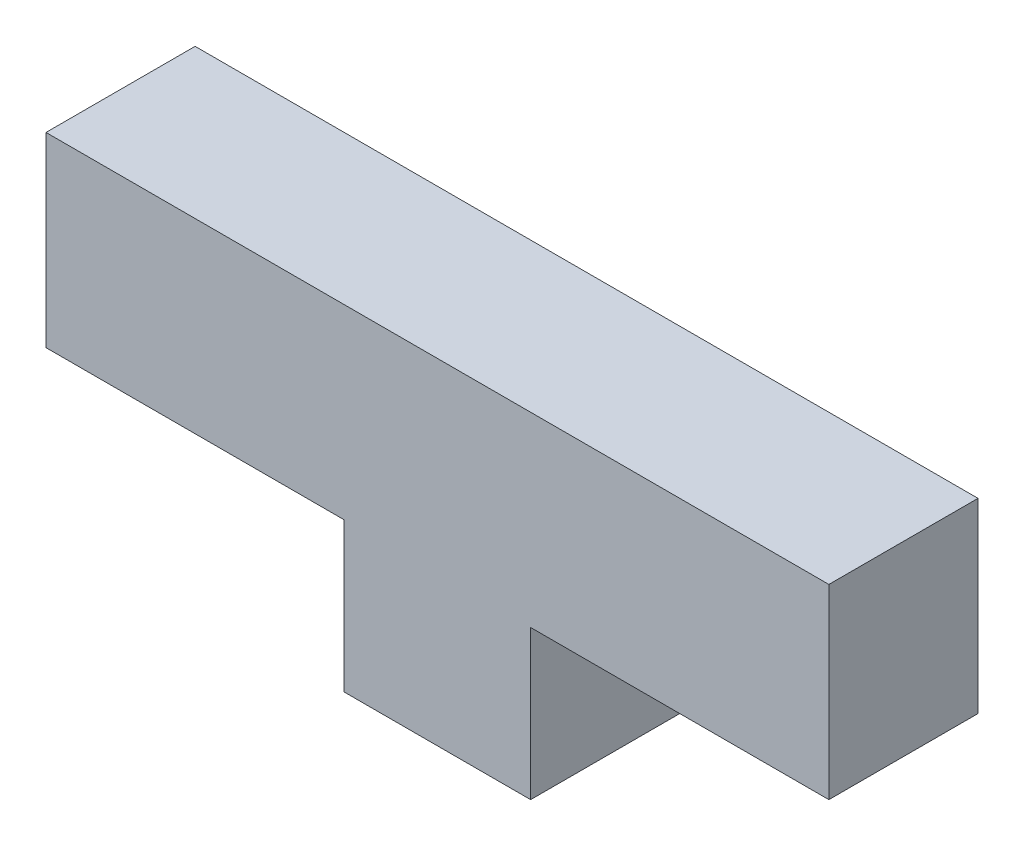
ISO-10303-21;
HEADER;
FILE_DESCRIPTION(('STEP AP214'),'2;1');
FILE_NAME('part.step','',(''),(''),'','','');
FILE_SCHEMA(('AUTOMOTIVE_DESIGN { 1 0 10303 214 1 1 1 1 }'));
ENDSEC;
DATA;
#1=APPLICATION_CONTEXT('core data for automotive mechanical design processes');
#2=APPLICATION_PROTOCOL_DEFINITION('international standard','automotive_design',2000,#1);
#3=PRODUCT_CONTEXT('',#1,'mechanical');
#4=PRODUCT('Part','Part','',(#3));
#5=PRODUCT_RELATED_PRODUCT_CATEGORY('part','',(#4));
#6=PRODUCT_DEFINITION_FORMATION('','',#4);
#7=PRODUCT_DEFINITION_CONTEXT('part definition',#1,'design');
#8=PRODUCT_DEFINITION('design','',#6,#7);
#9=PRODUCT_DEFINITION_SHAPE('','',#8);
#10=(LENGTH_UNIT() NAMED_UNIT(*) SI_UNIT(.MILLI.,.METRE.));
#11=(NAMED_UNIT(*) PLANE_ANGLE_UNIT() SI_UNIT($,.RADIAN.));
#12=(NAMED_UNIT(*) SI_UNIT($,.STERADIAN.) SOLID_ANGLE_UNIT());
#13=UNCERTAINTY_MEASURE_WITH_UNIT(LENGTH_MEASURE(1.E-05),#10,'distance_accuracy_value','');
#14=(GEOMETRIC_REPRESENTATION_CONTEXT(3) GLOBAL_UNCERTAINTY_ASSIGNED_CONTEXT((#13)) GLOBAL_UNIT_ASSIGNED_CONTEXT((#10,
#11,#12)) REPRESENTATION_CONTEXT('',''));
#15=CARTESIAN_POINT('',(0.,0.,0.));
#16=DIRECTION('',(0.,0.,1.));
#17=DIRECTION('',(1.,0.,0.));
#18=AXIS2_PLACEMENT_3D('',#15,#16,#17);
#19=CARTESIAN_POINT('',(3.175,-3.175,5.08));
#20=DIRECTION('',(0.,1.,0.));
#21=DIRECTION('',(-1.,0.,0.));
#22=AXIS2_PLACEMENT_3D('',#19,#20,#21);
#23=PLANE('',#22);
#24=DIRECTION('',(1.,0.,0.));
#25=VECTOR('',#24,1.);
#26=CARTESIAN_POINT('',(3.175,-3.175,0.));
#27=LINE('',#26,#25);
#28=CARTESIAN_POINT('',(3.175,-3.175,0.));
#29=VERTEX_POINT('',#28);
#30=CARTESIAN_POINT('',(13.3350000000001,-3.175,0.));
#31=VERTEX_POINT('',#30);
#32=EDGE_CURVE('E129',#29,#31,#27,.T.);
#33=ORIENTED_EDGE('',*,*,#32,.T.);
#34=DIRECTION('',(0.,0.,-1.));
#35=VECTOR('',#34,1.);
#36=CARTESIAN_POINT('',(13.3350000000001,-3.175,5.08));
#37=LINE('',#36,#35);
#38=CARTESIAN_POINT('',(13.3350000000001,-3.175,5.08));
#39=VERTEX_POINT('',#38);
#40=EDGE_CURVE('E11',#39,#31,#37,.T.);
#41=ORIENTED_EDGE('',*,*,#40,.F.);
#42=DIRECTION('',(1.,0.,0.));
#43=VECTOR('',#42,1.);
#44=CARTESIAN_POINT('',(3.175,-3.175,5.08));
#45=LINE('',#44,#43);
#46=CARTESIAN_POINT('',(3.175,-3.175,5.08));
#47=VERTEX_POINT('',#46);
#48=EDGE_CURVE('E143',#47,#39,#45,.T.);
#49=ORIENTED_EDGE('',*,*,#48,.F.);
#50=DIRECTION('',(0.,0.,-1.));
#51=VECTOR('',#50,1.);
#52=CARTESIAN_POINT('',(3.175,-3.175,5.08));
#53=LINE('',#52,#51);
#54=EDGE_CURVE('E125',#47,#29,#53,.T.);
#55=ORIENTED_EDGE('',*,*,#54,.T.);
#56=EDGE_LOOP('',(#33,#41,#49,#55));
#57=FACE_BOUND('',#56,.T.);
#58=ADVANCED_FACE('F33',(#57),#23,.F.);
#59=CARTESIAN_POINT('',(13.3350000000001,3.175,5.08));
#60=DIRECTION('',(-1.,0.,0.));
#61=DIRECTION('',(0.,0.,1.));
#62=AXIS2_PLACEMENT_3D('',#59,#60,#61);
#63=PLANE('',#62);
#64=DIRECTION('',(0.,1.,0.));
#65=VECTOR('',#64,1.);
#66=CARTESIAN_POINT('',(13.3350000000001,3.175,0.));
#67=LINE('',#66,#65);
#68=CARTESIAN_POINT('',(13.3350000000001,3.175,0.));
#69=VERTEX_POINT('',#68);
#70=EDGE_CURVE('E132',#31,#69,#67,.T.);
#71=ORIENTED_EDGE('',*,*,#70,.T.);
#72=DIRECTION('',(0.,0.,-1.));
#73=VECTOR('',#72,1.);
#74=CARTESIAN_POINT('',(13.3350000000001,3.175,5.08));
#75=LINE('',#74,#73);
#76=CARTESIAN_POINT('',(13.3350000000001,3.175,5.08));
#77=VERTEX_POINT('',#76);
#78=EDGE_CURVE('E41',#77,#69,#75,.T.);
#79=ORIENTED_EDGE('',*,*,#78,.F.);
#80=DIRECTION('',(0.,1.,0.));
#81=VECTOR('',#80,1.);
#82=CARTESIAN_POINT('',(13.3350000000001,3.175,5.08));
#83=LINE('',#82,#81);
#84=EDGE_CURVE('E92',#39,#77,#83,.T.);
#85=ORIENTED_EDGE('',*,*,#84,.F.);
#86=ORIENTED_EDGE('',*,*,#40,.T.);
#87=EDGE_LOOP('',(#71,#79,#85,#86));
#88=FACE_BOUND('',#87,.T.);
#89=ADVANCED_FACE('F178',(#88),#63,.F.);
#90=CARTESIAN_POINT('',(-13.3350000000001,3.175,5.08));
#91=DIRECTION('',(0.,-1.,0.));
#92=DIRECTION('',(0.,0.,-1.));
#93=AXIS2_PLACEMENT_3D('',#90,#91,#92);
#94=PLANE('',#93);
#95=DIRECTION('',(-1.,0.,0.));
#96=VECTOR('',#95,1.);
#97=CARTESIAN_POINT('',(-13.3350000000001,3.175,0.));
#98=LINE('',#97,#96);
#99=CARTESIAN_POINT('',(-13.3350000000001,3.175,0.));
#100=VERTEX_POINT('',#99);
#101=EDGE_CURVE('E134',#69,#100,#98,.T.);
#102=ORIENTED_EDGE('',*,*,#101,.T.);
#103=DIRECTION('',(0.,0.,-1.));
#104=VECTOR('',#103,1.);
#105=CARTESIAN_POINT('',(-13.3350000000001,3.175,5.08));
#106=LINE('',#105,#104);
#107=CARTESIAN_POINT('',(-13.3350000000001,3.175,5.08));
#108=VERTEX_POINT('',#107);
#109=EDGE_CURVE('E150',#108,#100,#106,.T.);
#110=ORIENTED_EDGE('',*,*,#109,.F.);
#111=DIRECTION('',(-1.,0.,0.));
#112=VECTOR('',#111,1.);
#113=CARTESIAN_POINT('',(-13.3350000000001,3.175,5.08));
#114=LINE('',#113,#112);
#115=EDGE_CURVE('E158',#77,#108,#114,.T.);
#116=ORIENTED_EDGE('',*,*,#115,.F.);
#117=ORIENTED_EDGE('',*,*,#78,.T.);
#118=EDGE_LOOP('',(#102,#110,#116,#117));
#119=FACE_BOUND('',#118,.T.);
#120=ADVANCED_FACE('F156',(#119),#94,.F.);
#121=CARTESIAN_POINT('',(-13.3350000000001,3.175,5.08));
#122=DIRECTION('',(1.,0.,0.));
#123=DIRECTION('',(0.,0.,-1.));
#124=AXIS2_PLACEMENT_3D('',#121,#122,#123);
#125=PLANE('',#124);
#126=DIRECTION('',(0.,-1.,0.));
#127=VECTOR('',#126,1.);
#128=CARTESIAN_POINT('',(-13.3350000000001,3.175,0.));
#129=LINE('',#128,#127);
#130=CARTESIAN_POINT('',(-13.3350000000001,-3.175,0.));
#131=VERTEX_POINT('',#130);
#132=EDGE_CURVE('E136',#100,#131,#129,.T.);
#133=ORIENTED_EDGE('',*,*,#132,.T.);
#134=DIRECTION('',(0.,0.,-1.));
#135=VECTOR('',#134,1.);
#136=CARTESIAN_POINT('',(-13.3350000000001,-3.175,5.08));
#137=LINE('',#136,#135);
#138=CARTESIAN_POINT('',(-13.3350000000001,-3.175,5.08));
#139=VERTEX_POINT('',#138);
#140=EDGE_CURVE('E147',#139,#131,#137,.T.);
#141=ORIENTED_EDGE('',*,*,#140,.F.);
#142=DIRECTION('',(0.,-1.,0.));
#143=VECTOR('',#142,1.);
#144=CARTESIAN_POINT('',(-13.3350000000001,3.175,5.08));
#145=LINE('',#144,#143);
#146=EDGE_CURVE('E170',#108,#139,#145,.T.);
#147=ORIENTED_EDGE('',*,*,#146,.F.);
#148=ORIENTED_EDGE('',*,*,#109,.T.);
#149=EDGE_LOOP('',(#133,#141,#147,#148));
#150=FACE_BOUND('',#149,.T.);
#151=ADVANCED_FACE('F166',(#150),#125,.F.);
#152=CARTESIAN_POINT('',(-3.175,-3.175,5.08));
#153=DIRECTION('',(0.,1.,0.));
#154=DIRECTION('',(-1.,0.,0.));
#155=AXIS2_PLACEMENT_3D('',#152,#153,#154);
#156=PLANE('',#155);
#157=DIRECTION('',(1.,0.,0.));
#158=VECTOR('',#157,1.);
#159=CARTESIAN_POINT('',(-3.175,-3.175,0.));
#160=LINE('',#159,#158);
#161=CARTESIAN_POINT('',(-3.175,-3.175,0.));
#162=VERTEX_POINT('',#161);
#163=EDGE_CURVE('E138',#131,#162,#160,.T.);
#164=ORIENTED_EDGE('',*,*,#163,.T.);
#165=DIRECTION('',(0.,0.,-1.));
#166=VECTOR('',#165,1.);
#167=CARTESIAN_POINT('',(-3.175,-3.175,5.08));
#168=LINE('',#167,#166);
#169=CARTESIAN_POINT('',(-3.175,-3.175,5.08));
#170=VERTEX_POINT('',#169);
#171=EDGE_CURVE('E120',#170,#162,#168,.T.);
#172=ORIENTED_EDGE('',*,*,#171,.F.);
#173=DIRECTION('',(1.,0.,0.));
#174=VECTOR('',#173,1.);
#175=CARTESIAN_POINT('',(-3.175,-3.175,5.08));
#176=LINE('',#175,#174);
#177=EDGE_CURVE('E111',#139,#170,#176,.T.);
#178=ORIENTED_EDGE('',*,*,#177,.F.);
#179=ORIENTED_EDGE('',*,*,#140,.T.);
#180=EDGE_LOOP('',(#164,#172,#178,#179));
#181=FACE_BOUND('',#180,.T.);
#182=ADVANCED_FACE('F169',(#181),#156,.F.);
#183=CARTESIAN_POINT('',(-3.175,-3.175,5.08));
#184=DIRECTION('',(1.,0.,0.));
#185=DIRECTION('',(0.,1.,0.));
#186=AXIS2_PLACEMENT_3D('',#183,#184,#185);
#187=PLANE('',#186);
#188=DIRECTION('',(0.,-1.,0.));
#189=VECTOR('',#188,1.);
#190=CARTESIAN_POINT('',(-3.175,-3.175,0.));
#191=LINE('',#190,#189);
#192=CARTESIAN_POINT('',(-3.175,-8.255,0.));
#193=VERTEX_POINT('',#192);
#194=EDGE_CURVE('E119',#162,#193,#191,.T.);
#195=ORIENTED_EDGE('',*,*,#194,.T.);
#196=DIRECTION('',(0.,0.,-1.));
#197=VECTOR('',#196,1.);
#198=CARTESIAN_POINT('',(-3.175,-8.255,5.08));
#199=LINE('',#198,#197);
#200=CARTESIAN_POINT('',(-3.175,-8.255,5.08));
#201=VERTEX_POINT('',#200);
#202=EDGE_CURVE('E116',#201,#193,#199,.T.);
#203=ORIENTED_EDGE('',*,*,#202,.F.);
#204=DIRECTION('',(0.,-1.,0.));
#205=VECTOR('',#204,1.);
#206=CARTESIAN_POINT('',(-3.175,-3.175,5.08));
#207=LINE('',#206,#205);
#208=EDGE_CURVE('E105',#170,#201,#207,.T.);
#209=ORIENTED_EDGE('',*,*,#208,.F.);
#210=ORIENTED_EDGE('',*,*,#171,.T.);
#211=EDGE_LOOP('',(#195,#203,#209,#210));
#212=FACE_BOUND('',#211,.T.);
#213=ADVANCED_FACE('F117',(#212),#187,.F.);
#214=CARTESIAN_POINT('',(-3.175,-8.255,5.08));
#215=DIRECTION('',(0.,1.,0.));
#216=DIRECTION('',(0.,0.,1.));
#217=AXIS2_PLACEMENT_3D('',#214,#215,#216);
#218=PLANE('',#217);
#219=DIRECTION('',(1.,0.,0.));
#220=VECTOR('',#219,1.);
#221=CARTESIAN_POINT('',(-3.175,-8.255,0.));
#222=LINE('',#221,#220);
#223=CARTESIAN_POINT('',(3.175,-8.255,0.));
#224=VERTEX_POINT('',#223);
#225=EDGE_CURVE('E78',#193,#224,#222,.T.);
#226=ORIENTED_EDGE('',*,*,#225,.T.);
#227=DIRECTION('',(0.,0.,-1.));
#228=VECTOR('',#227,1.);
#229=CARTESIAN_POINT('',(3.175,-8.255,5.08));
#230=LINE('',#229,#228);
#231=CARTESIAN_POINT('',(3.175,-8.255,5.08));
#232=VERTEX_POINT('',#231);
#233=EDGE_CURVE('E121',#232,#224,#230,.T.);
#234=ORIENTED_EDGE('',*,*,#233,.F.);
#235=DIRECTION('',(1.,0.,0.));
#236=VECTOR('',#235,1.);
#237=CARTESIAN_POINT('',(-3.175,-8.255,5.08));
#238=LINE('',#237,#236);
#239=EDGE_CURVE('E109',#201,#232,#238,.T.);
#240=ORIENTED_EDGE('',*,*,#239,.F.);
#241=ORIENTED_EDGE('',*,*,#202,.T.);
#242=EDGE_LOOP('',(#226,#234,#240,#241));
#243=FACE_BOUND('',#242,.T.);
#244=ADVANCED_FACE('F123',(#243),#218,.F.);
#245=CARTESIAN_POINT('',(3.175,-8.255,5.08));
#246=DIRECTION('',(-1.,0.,0.));
#247=DIRECTION('',(0.,-1.,0.));
#248=AXIS2_PLACEMENT_3D('',#245,#246,#247);
#249=PLANE('',#248);
#250=DIRECTION('',(0.,1.,0.));
#251=VECTOR('',#250,1.);
#252=CARTESIAN_POINT('',(3.175,-8.255,0.));
#253=LINE('',#252,#251);
#254=EDGE_CURVE('E84',#224,#29,#253,.T.);
#255=ORIENTED_EDGE('',*,*,#254,.T.);
#256=ORIENTED_EDGE('',*,*,#54,.F.);
#257=DIRECTION('',(0.,1.,0.));
#258=VECTOR('',#257,1.);
#259=CARTESIAN_POINT('',(3.175,-8.255,5.08));
#260=LINE('',#259,#258);
#261=EDGE_CURVE('E49',#232,#47,#260,.T.);
#262=ORIENTED_EDGE('',*,*,#261,.F.);
#263=ORIENTED_EDGE('',*,*,#233,.T.);
#264=EDGE_LOOP('',(#255,#256,#262,#263));
#265=FACE_BOUND('',#264,.T.);
#266=ADVANCED_FACE('F194',(#265),#249,.F.);
#267=CARTESIAN_POINT('',(0.,0.,5.08));
#268=DIRECTION('',(0.,0.,-1.));
#269=DIRECTION('',(-1.,0.,0.));
#270=AXIS2_PLACEMENT_3D('',#267,#268,#269);
#271=PLANE('',#270);
#272=ORIENTED_EDGE('',*,*,#48,.T.);
#273=ORIENTED_EDGE('',*,*,#84,.T.);
#274=ORIENTED_EDGE('',*,*,#115,.T.);
#275=ORIENTED_EDGE('',*,*,#146,.T.);
#276=ORIENTED_EDGE('',*,*,#177,.T.);
#277=ORIENTED_EDGE('',*,*,#208,.T.);
#278=ORIENTED_EDGE('',*,*,#239,.T.);
#279=ORIENTED_EDGE('',*,*,#261,.T.);
#280=EDGE_LOOP('',(#272,#273,#274,#275,#276,#277,#278,#279));
#281=FACE_BOUND('',#280,.T.);
#282=ADVANCED_FACE('F107',(#281),#271,.F.);
#283=CARTESIAN_POINT('',(0.,0.,0.));
#284=DIRECTION('',(0.,0.,-1.));
#285=DIRECTION('',(-1.,0.,0.));
#286=AXIS2_PLACEMENT_3D('',#283,#284,#285);
#287=PLANE('',#286);
#288=ORIENTED_EDGE('',*,*,#32,.F.);
#289=ORIENTED_EDGE('',*,*,#254,.F.);
#290=ORIENTED_EDGE('',*,*,#225,.F.);
#291=ORIENTED_EDGE('',*,*,#194,.F.);
#292=ORIENTED_EDGE('',*,*,#163,.F.);
#293=ORIENTED_EDGE('',*,*,#132,.F.);
#294=ORIENTED_EDGE('',*,*,#101,.F.);
#295=ORIENTED_EDGE('',*,*,#70,.F.);
#296=EDGE_LOOP('',(#288,#289,#290,#291,#292,#293,#294,#295));
#297=FACE_BOUND('',#296,.T.);
#298=ADVANCED_FACE('F162',(#297),#287,.T.);
#299=CLOSED_SHELL('',(#58,#89,#120,#151,#182,#213,#244,#266,#282,#298));
#300=MANIFOLD_SOLID_BREP('B2',#299);
#301=ADVANCED_BREP_SHAPE_REPRESENTATION('',(#18,#300),#14);
#302=SHAPE_DEFINITION_REPRESENTATION(#9,#301);
ENDSEC;
END-ISO-10303-21;
